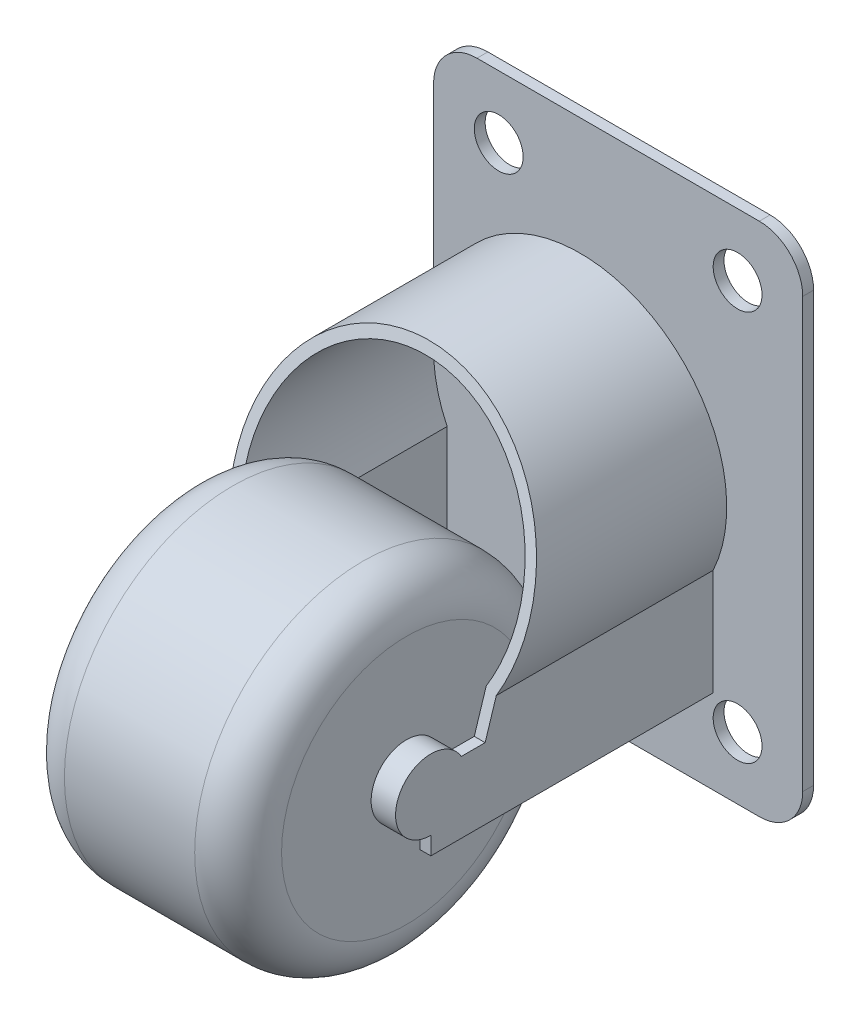
ISO-10303-21;
HEADER;
FILE_DESCRIPTION(('STEP AP214'),'2;1');
FILE_NAME('part.step','',(''),(''),'','','');
FILE_SCHEMA(('AUTOMOTIVE_DESIGN { 1 0 10303 214 1 1 1 1 }'));
ENDSEC;
DATA;
#1=APPLICATION_CONTEXT('core data for automotive mechanical design processes');
#2=APPLICATION_PROTOCOL_DEFINITION('international standard','automotive_design',2000,#1);
#3=PRODUCT_CONTEXT('',#1,'mechanical');
#4=PRODUCT('Part','Part','',(#3));
#5=PRODUCT_RELATED_PRODUCT_CATEGORY('part','',(#4));
#6=PRODUCT_DEFINITION_FORMATION('','',#4);
#7=PRODUCT_DEFINITION_CONTEXT('part definition',#1,'design');
#8=PRODUCT_DEFINITION('design','',#6,#7);
#9=PRODUCT_DEFINITION_SHAPE('','',#8);
#10=(LENGTH_UNIT() NAMED_UNIT(*) SI_UNIT(.MILLI.,.METRE.));
#11=(NAMED_UNIT(*) PLANE_ANGLE_UNIT() SI_UNIT($,.RADIAN.));
#12=(NAMED_UNIT(*) SI_UNIT($,.STERADIAN.) SOLID_ANGLE_UNIT());
#13=UNCERTAINTY_MEASURE_WITH_UNIT(LENGTH_MEASURE(1.E-05),#10,'distance_accuracy_value','');
#14=(GEOMETRIC_REPRESENTATION_CONTEXT(3) GLOBAL_UNCERTAINTY_ASSIGNED_CONTEXT((#13)) GLOBAL_UNIT_ASSIGNED_CONTEXT((#10,
#11,#12)) REPRESENTATION_CONTEXT('',''));
#15=CARTESIAN_POINT('',(0.,0.,0.));
#16=DIRECTION('',(0.,0.,1.));
#17=DIRECTION('',(1.,0.,0.));
#18=AXIS2_PLACEMENT_3D('',#15,#16,#17);
#19=CARTESIAN_POINT('',(-2.,0.,50.));
#20=DIRECTION('',(1.,0.,0.));
#21=DIRECTION('',(0.,0.,-1.));
#22=AXIS2_PLACEMENT_3D('',#19,#20,#21);
#23=PLANE('',#22);
#24=DIRECTION('',(0.,1.,0.));
#25=VECTOR('',#24,1.);
#26=CARTESIAN_POINT('',(-2.,0.,50.));
#27=LINE('',#26,#25);
#28=CARTESIAN_POINT('',(-2.,3.27522082047074,50.));
#29=VERTEX_POINT('',#28);
#30=CARTESIAN_POINT('',(-2.,0.,50.));
#31=VERTEX_POINT('',#30);
#32=EDGE_CURVE('E312',#29,#31,#27,.F.);
#33=ORIENTED_EDGE('',*,*,#32,.F.);
#34=CARTESIAN_POINT('',(-2.,9.77522082047074,50.));
#35=DIRECTION('',(1.,0.,0.));
#36=DIRECTION('',(0.,0.,-1.));
#37=AXIS2_PLACEMENT_3D('',#34,#35,#36);
#38=CIRCLE('',#37,6.5);
#39=CARTESIAN_POINT('',(-2.,13.0632888473468,44.392985763293));
#40=VERTEX_POINT('',#39);
#41=EDGE_CURVE('E256',#29,#40,#38,.F.);
#42=ORIENTED_EDGE('',*,*,#41,.T.);
#43=DIRECTION('',(0.,0.,-1.));
#44=VECTOR('',#43,1.);
#45=CARTESIAN_POINT('',(-2.,13.0632888473468,50.));
#46=LINE('',#45,#44);
#47=CARTESIAN_POINT('',(-2.,13.0632888473468,40.));
#48=VERTEX_POINT('',#47);
#49=EDGE_CURVE('E308',#40,#48,#46,.T.);
#50=ORIENTED_EDGE('',*,*,#49,.T.);
#51=DIRECTION('',(0.,0.95333132220003,-0.301926133536569));
#52=VECTOR('',#51,1.);
#53=CARTESIAN_POINT('',(-2.,-1.68751495672611,44.6716740081952));
#54=LINE('',#53,#52);
#55=CARTESIAN_POINT('',(-2.,19.5504416409415,37.9454771756466));
#56=VERTEX_POINT('',#55);
#57=EDGE_CURVE('E290',#48,#56,#54,.T.);
#58=ORIENTED_EDGE('',*,*,#57,.T.);
#59=DIRECTION('',(0.,0.,-1.));
#60=VECTOR('',#59,1.);
#61=CARTESIAN_POINT('',(-2.,19.5504416409415,50.));
#62=LINE('',#61,#60);
#63=CARTESIAN_POINT('',(-2.,19.5504416409415,-2.));
#64=VERTEX_POINT('',#63);
#65=EDGE_CURVE('E210',#56,#64,#62,.T.);
#66=ORIENTED_EDGE('',*,*,#65,.T.);
#67=DIRECTION('',(0.,1.,0.));
#68=VECTOR('',#67,1.);
#69=CARTESIAN_POINT('',(-2.,0.,-2.));
#70=LINE('',#69,#68);
#71=CARTESIAN_POINT('',(-2.,0.,-2.));
#72=VERTEX_POINT('',#71);
#73=EDGE_CURVE('E207',#72,#64,#70,.T.);
#74=ORIENTED_EDGE('',*,*,#73,.F.);
#75=DIRECTION('',(0.,0.,-1.));
#76=VECTOR('',#75,1.);
#77=CARTESIAN_POINT('',(-2.,0.,50.));
#78=LINE('',#77,#76);
#79=EDGE_CURVE('E192',#31,#72,#78,.T.);
#80=ORIENTED_EDGE('',*,*,#79,.F.);
#81=EDGE_LOOP('',(#33,#42,#50,#58,#66,#74,#80));
#82=FACE_BOUND('',#81,.T.);
#83=ADVANCED_FACE('F38',(#82),#23,.F.);
#84=CARTESIAN_POINT('',(-20.3847763108502,9.77522082047074,50.));
#85=DIRECTION('',(1.,0.,0.));
#86=DIRECTION('',(0.,0.,-1.));
#87=AXIS2_PLACEMENT_3D('',#84,#85,#86);
#88=CYLINDRICAL_SURFACE('',#87,6.5);
#89=ORIENTED_EDGE('',*,*,#41,.F.);
#90=DIRECTION('',(1.,0.,0.));
#91=VECTOR('',#90,1.);
#92=CARTESIAN_POINT('',(-20.3847763108502,3.27522082047074,50.));
#93=LINE('',#92,#91);
#94=CARTESIAN_POINT('',(0.,3.27522082047074,50.));
#95=VERTEX_POINT('',#94);
#96=EDGE_CURVE('E268',#29,#95,#93,.T.);
#97=ORIENTED_EDGE('',*,*,#96,.T.);
#98=CARTESIAN_POINT('',(0.,9.77522082047074,50.));
#99=DIRECTION('',(1.,0.,0.));
#100=DIRECTION('',(0.,0.,-1.));
#101=AXIS2_PLACEMENT_3D('',#98,#99,#100);
#102=CIRCLE('',#101,6.5);
#103=CARTESIAN_POINT('',(0.,13.0632888473468,44.392985763293));
#104=VERTEX_POINT('',#103);
#105=EDGE_CURVE('E265',#95,#104,#102,.T.);
#106=ORIENTED_EDGE('',*,*,#105,.T.);
#107=DIRECTION('',(1.,0.,0.));
#108=VECTOR('',#107,1.);
#109=CARTESIAN_POINT('',(-20.3847763108502,13.0632888473468,44.392985763293));
#110=LINE('',#109,#108);
#111=EDGE_CURVE('E269',#40,#104,#110,.T.);
#112=ORIENTED_EDGE('',*,*,#111,.F.);
#113=EDGE_LOOP('',(#89,#97,#106,#112));
#114=FACE_BOUND('',#113,.T.);
#115=CARTESIAN_POINT('',(2.5,9.77522082047074,50.));
#116=DIRECTION('',(1.,0.,0.));
#117=DIRECTION('',(0.,0.,-1.));
#118=AXIS2_PLACEMENT_3D('',#115,#116,#117);
#119=CIRCLE('',#118,6.5);
#120=CARTESIAN_POINT('',(2.5,9.77522082047074,43.5));
#121=VERTEX_POINT('',#120);
#122=EDGE_CURVE('E252',#121,#121,#119,.F.);
#123=ORIENTED_EDGE('',*,*,#122,.T.);
#124=EDGE_LOOP('',(#123));
#125=FACE_BOUND('',#124,.T.);
#126=ADVANCED_FACE('F538',(#114,#125),#88,.T.);
#127=CARTESIAN_POINT('',(22.5,30.8972473588517,50.));
#128=DIRECTION('',(0.,0.,1.));
#129=DIRECTION('',(1.,0.,0.));
#130=AXIS2_PLACEMENT_3D('',#127,#128,#129);
#131=PLANE('',#130);
#132=ORIENTED_EDGE('',*,*,#96,.F.);
#133=ORIENTED_EDGE('',*,*,#32,.T.);
#134=DIRECTION('',(-1.,0.,0.));
#135=VECTOR('',#134,1.);
#136=CARTESIAN_POINT('',(0.,0.,50.));
#137=LINE('',#136,#135);
#138=CARTESIAN_POINT('',(0.,0.,50.));
#139=VERTEX_POINT('',#138);
#140=EDGE_CURVE('E199',#139,#31,#137,.T.);
#141=ORIENTED_EDGE('',*,*,#140,.F.);
#142=DIRECTION('',(0.,-1.,0.));
#143=VECTOR('',#142,1.);
#144=CARTESIAN_POINT('',(0.,0.,50.));
#145=LINE('',#144,#143);
#146=EDGE_CURVE('E318',#95,#139,#145,.T.);
#147=ORIENTED_EDGE('',*,*,#146,.F.);
#148=EDGE_LOOP('',(#132,#133,#141,#147));
#149=FACE_BOUND('',#148,.T.);
#150=ADVANCED_FACE('F543',(#149),#131,.T.);
#151=DIRECTION('',(1.,0.,0.));
#152=VECTOR('',#151,1.);
#153=CARTESIAN_POINT('',(-20.3847763108502,3.27522082047074,50.));
#154=LINE('',#153,#152);
#155=CARTESIAN_POINT('',(45.,3.27522082047074,50.));
#156=VERTEX_POINT('',#155);
#157=CARTESIAN_POINT('',(47.,3.27522082047074,50.));
#158=VERTEX_POINT('',#157);
#159=EDGE_CURVE('E264',#156,#158,#154,.T.);
#160=ORIENTED_EDGE('',*,*,#159,.F.);
#161=DIRECTION('',(0.,1.,0.));
#162=VECTOR('',#161,1.);
#163=CARTESIAN_POINT('',(45.,0.,50.));
#164=LINE('',#163,#162);
#165=CARTESIAN_POINT('',(45.,0.,50.));
#166=VERTEX_POINT('',#165);
#167=EDGE_CURVE('E321',#166,#156,#164,.T.);
#168=ORIENTED_EDGE('',*,*,#167,.F.);
#169=DIRECTION('',(-1.,0.,0.));
#170=VECTOR('',#169,1.);
#171=CARTESIAN_POINT('',(47.,0.,50.));
#172=LINE('',#171,#170);
#173=CARTESIAN_POINT('',(47.,0.,50.));
#174=VERTEX_POINT('',#173);
#175=EDGE_CURVE('E325',#174,#166,#172,.T.);
#176=ORIENTED_EDGE('',*,*,#175,.F.);
#177=DIRECTION('',(0.,1.,0.));
#178=VECTOR('',#177,1.);
#179=CARTESIAN_POINT('',(47.,0.,50.));
#180=LINE('',#179,#178);
#181=EDGE_CURVE('E329',#174,#158,#180,.T.);
#182=ORIENTED_EDGE('',*,*,#181,.T.);
#183=EDGE_LOOP('',(#160,#168,#176,#182));
#184=FACE_BOUND('',#183,.T.);
#185=ADVANCED_FACE('F828',(#184),#131,.T.);
#186=CARTESIAN_POINT('',(22.5,30.8972473588517,50.));
#187=DIRECTION('',(0.,0.,-1.));
#188=DIRECTION('',(-1.,0.,0.));
#189=AXIS2_PLACEMENT_3D('',#186,#187,#188);
#190=CYLINDRICAL_SURFACE('',#189,25.);
#191=CARTESIAN_POINT('',(22.5,30.8972473588517,34.3518711557654));
#192=DIRECTION('',(0.,-0.301926133536569,-0.95333132220003));
#193=DIRECTION('',(0.,0.95333132220003,-0.301926133536569));
#194=AXIS2_PLACEMENT_3D('',#191,#192,#193);
#195=ELLIPSE('',#194,26.2238315450569,25.);
#196=CARTESIAN_POINT('',(0.,20.,37.8030991649919));
#197=VERTEX_POINT('',#196);
#198=CARTESIAN_POINT('',(45.,20.,37.8030991649919));
#199=VERTEX_POINT('',#198);
#200=EDGE_CURVE('E296',#197,#199,#195,.T.);
#201=ORIENTED_EDGE('',*,*,#200,.F.);
#202=DIRECTION('',(0.,0.,-1.));
#203=VECTOR('',#202,1.);
#204=CARTESIAN_POINT('',(0.,20.,50.));
#205=LINE('',#204,#203);
#206=CARTESIAN_POINT('',(0.,20.,0.));
#207=VERTEX_POINT('',#206);
#208=EDGE_CURVE('E357',#197,#207,#205,.T.);
#209=ORIENTED_EDGE('',*,*,#208,.T.);
#210=CARTESIAN_POINT('',(22.5,30.8972473588517,0.));
#211=DIRECTION('',(0.,0.,1.));
#212=DIRECTION('',(-1.,0.,0.));
#213=AXIS2_PLACEMENT_3D('',#210,#211,#212);
#214=CIRCLE('',#213,25.);
#215=CARTESIAN_POINT('',(45.,20.,0.));
#216=VERTEX_POINT('',#215);
#217=EDGE_CURVE('E336',#216,#207,#214,.T.);
#218=ORIENTED_EDGE('',*,*,#217,.F.);
#219=DIRECTION('',(0.,0.,-1.));
#220=VECTOR('',#219,1.);
#221=CARTESIAN_POINT('',(45.,20.,50.));
#222=LINE('',#221,#220);
#223=EDGE_CURVE('E354',#199,#216,#222,.T.);
#224=ORIENTED_EDGE('',*,*,#223,.F.);
#225=EDGE_LOOP('',(#201,#209,#218,#224));
#226=FACE_BOUND('',#225,.T.);
#227=ADVANCED_FACE('F819',(#226),#190,.F.);
#228=CARTESIAN_POINT('',(22.5,30.8972473588517,50.));
#229=DIRECTION('',(0.,0.,-1.));
#230=DIRECTION('',(-1.,0.,0.));
#231=AXIS2_PLACEMENT_3D('',#228,#229,#230);
#232=CYLINDRICAL_SURFACE('',#231,27.);
#233=CARTESIAN_POINT('',(22.5,30.8972473588517,34.3518711557654));
#234=DIRECTION('',(0.,-0.301926133536569,-0.95333132220003));
#235=DIRECTION('',(0.,0.95333132220003,-0.301926133536569));
#236=AXIS2_PLACEMENT_3D('',#233,#234,#235);
#237=ELLIPSE('',#236,28.3217380686615,27.);
#238=CARTESIAN_POINT('',(47.,19.5504416409415,37.9454771756466));
#239=VERTEX_POINT('',#238);
#240=EDGE_CURVE('E203',#56,#239,#237,.T.);
#241=ORIENTED_EDGE('',*,*,#240,.T.);
#242=DIRECTION('',(0.,0.,-1.));
#243=VECTOR('',#242,1.);
#244=CARTESIAN_POINT('',(47.,19.5504416409415,50.));
#245=LINE('',#244,#243);
#246=CARTESIAN_POINT('',(47.,19.5504416409415,-2.));
#247=VERTEX_POINT('',#246);
#248=EDGE_CURVE('E345',#239,#247,#245,.T.);
#249=ORIENTED_EDGE('',*,*,#248,.T.);
#250=CARTESIAN_POINT('',(22.5,30.8972473588517,-2.));
#251=DIRECTION('',(0.,0.,-1.));
#252=DIRECTION('',(-1.,0.,0.));
#253=AXIS2_PLACEMENT_3D('',#250,#251,#252);
#254=CIRCLE('',#253,27.);
#255=EDGE_CURVE('E215',#64,#247,#254,.T.);
#256=ORIENTED_EDGE('',*,*,#255,.F.);
#257=ORIENTED_EDGE('',*,*,#65,.F.);
#258=EDGE_LOOP('',(#241,#249,#256,#257));
#259=FACE_BOUND('',#258,.T.);
#260=ADVANCED_FACE('F667',(#259),#232,.T.);
#261=CARTESIAN_POINT('',(0.,0.,50.));
#262=DIRECTION('',(1.,0.,0.));
#263=DIRECTION('',(0.,0.,-1.));
#264=AXIS2_PLACEMENT_3D('',#261,#262,#263);
#265=PLANE('',#264);
#266=ORIENTED_EDGE('',*,*,#105,.F.);
#267=ORIENTED_EDGE('',*,*,#146,.T.);
#268=DIRECTION('',(0.,0.,-1.));
#269=VECTOR('',#268,1.);
#270=CARTESIAN_POINT('',(0.,0.,50.));
#271=LINE('',#270,#269);
#272=CARTESIAN_POINT('',(0.,0.,0.));
#273=VERTEX_POINT('',#272);
#274=EDGE_CURVE('E204',#139,#273,#271,.T.);
#275=ORIENTED_EDGE('',*,*,#274,.T.);
#276=DIRECTION('',(0.,-1.,0.));
#277=VECTOR('',#276,1.);
#278=CARTESIAN_POINT('',(0.,0.,0.));
#279=LINE('',#278,#277);
#280=EDGE_CURVE('E311',#207,#273,#279,.T.);
#281=ORIENTED_EDGE('',*,*,#280,.F.);
#282=ORIENTED_EDGE('',*,*,#208,.F.);
#283=DIRECTION('',(0.,0.95333132220003,-0.301926133536569));
#284=VECTOR('',#283,1.);
#285=CARTESIAN_POINT('',(0.,-1.68751495672611,44.6716740081952));
#286=LINE('',#285,#284);
#287=CARTESIAN_POINT('',(0.,13.0632888473468,40.));
#288=VERTEX_POINT('',#287);
#289=EDGE_CURVE('E299',#288,#197,#286,.T.);
#290=ORIENTED_EDGE('',*,*,#289,.F.);
#291=DIRECTION('',(0.,0.,-1.));
#292=VECTOR('',#291,1.);
#293=CARTESIAN_POINT('',(0.,13.0632888473468,50.));
#294=LINE('',#293,#292);
#295=EDGE_CURVE('E305',#104,#288,#294,.T.);
#296=ORIENTED_EDGE('',*,*,#295,.F.);
#297=EDGE_LOOP('',(#266,#267,#275,#281,#282,#290,#296));
#298=FACE_BOUND('',#297,.T.);
#299=ADVANCED_FACE('F549',(#298),#265,.T.);
#300=CARTESIAN_POINT('',(45.,0.,50.));
#301=DIRECTION('',(-1.,0.,0.));
#302=DIRECTION('',(0.,0.,1.));
#303=AXIS2_PLACEMENT_3D('',#300,#301,#302);
#304=PLANE('',#303);
#305=CARTESIAN_POINT('',(45.,9.77522082047074,50.));
#306=DIRECTION('',(-1.,0.,0.));
#307=DIRECTION('',(0.,0.,1.));
#308=AXIS2_PLACEMENT_3D('',#305,#306,#307);
#309=CIRCLE('',#308,6.5);
#310=CARTESIAN_POINT('',(45.,13.0632888473468,44.392985763293));
#311=VERTEX_POINT('',#310);
#312=EDGE_CURVE('E261',#311,#156,#309,.T.);
#313=ORIENTED_EDGE('',*,*,#312,.F.);
#314=DIRECTION('',(0.,0.,1.));
#315=VECTOR('',#314,1.);
#316=CARTESIAN_POINT('',(45.,13.0632888473468,50.));
#317=LINE('',#316,#315);
#318=CARTESIAN_POINT('',(45.,13.0632888473468,40.));
#319=VERTEX_POINT('',#318);
#320=EDGE_CURVE('E302',#319,#311,#317,.T.);
#321=ORIENTED_EDGE('',*,*,#320,.F.);
#322=DIRECTION('',(0.,-0.95333132220003,0.301926133536569));
#323=VECTOR('',#322,1.);
#324=CARTESIAN_POINT('',(45.,-1.6875149567261,44.6716740081952));
#325=LINE('',#324,#323);
#326=EDGE_CURVE('E293',#199,#319,#325,.T.);
#327=ORIENTED_EDGE('',*,*,#326,.F.);
#328=ORIENTED_EDGE('',*,*,#223,.T.);
#329=DIRECTION('',(0.,1.,0.));
#330=VECTOR('',#329,1.);
#331=CARTESIAN_POINT('',(45.,0.,0.));
#332=LINE('',#331,#330);
#333=CARTESIAN_POINT('',(45.,0.,0.));
#334=VERTEX_POINT('',#333);
#335=EDGE_CURVE('E315',#334,#216,#332,.T.);
#336=ORIENTED_EDGE('',*,*,#335,.F.);
#337=DIRECTION('',(0.,0.,-1.));
#338=VECTOR('',#337,1.);
#339=CARTESIAN_POINT('',(45.,0.,50.));
#340=LINE('',#339,#338);
#341=EDGE_CURVE('E351',#166,#334,#340,.T.);
#342=ORIENTED_EDGE('',*,*,#341,.F.);
#343=ORIENTED_EDGE('',*,*,#167,.T.);
#344=EDGE_LOOP('',(#313,#321,#327,#328,#336,#342,#343));
#345=FACE_BOUND('',#344,.T.);
#346=ADVANCED_FACE('F666',(#345),#304,.T.);
#347=CARTESIAN_POINT('',(47.,0.,50.));
#348=DIRECTION('',(0.,-1.,0.));
#349=DIRECTION('',(0.,0.,-1.));
#350=AXIS2_PLACEMENT_3D('',#347,#348,#349);
#351=PLANE('',#350);
#352=ORIENTED_EDGE('',*,*,#341,.T.);
#353=DIRECTION('',(-1.,0.,0.));
#354=VECTOR('',#353,1.);
#355=CARTESIAN_POINT('',(47.,0.,0.));
#356=LINE('',#355,#354);
#357=EDGE_CURVE('E222',#334,#273,#356,.T.);
#358=ORIENTED_EDGE('',*,*,#357,.T.);
#359=ORIENTED_EDGE('',*,*,#274,.F.);
#360=ORIENTED_EDGE('',*,*,#140,.T.);
#361=ORIENTED_EDGE('',*,*,#79,.T.);
#362=DIRECTION('',(-1.,0.,0.));
#363=VECTOR('',#362,1.);
#364=CARTESIAN_POINT('',(47.,0.,-2.));
#365=LINE('',#364,#363);
#366=CARTESIAN_POINT('',(47.,0.,-2.));
#367=VERTEX_POINT('',#366);
#368=EDGE_CURVE('E196',#367,#72,#365,.T.);
#369=ORIENTED_EDGE('',*,*,#368,.F.);
#370=DIRECTION('',(0.,0.,-1.));
#371=VECTOR('',#370,1.);
#372=CARTESIAN_POINT('',(47.,0.,50.));
#373=LINE('',#372,#371);
#374=EDGE_CURVE('E348',#174,#367,#373,.T.);
#375=ORIENTED_EDGE('',*,*,#374,.F.);
#376=ORIENTED_EDGE('',*,*,#175,.T.);
#377=EDGE_LOOP('',(#352,#358,#359,#360,#361,#369,#375,#376));
#378=FACE_BOUND('',#377,.T.);
#379=ADVANCED_FACE('F194',(#378),#351,.T.);
#380=CARTESIAN_POINT('',(47.,0.,50.));
#381=DIRECTION('',(-1.,0.,0.));
#382=DIRECTION('',(0.,0.,1.));
#383=AXIS2_PLACEMENT_3D('',#380,#381,#382);
#384=PLANE('',#383);
#385=CARTESIAN_POINT('',(47.,9.77522082047074,50.));
#386=DIRECTION('',(1.,0.,0.));
#387=DIRECTION('',(0.,0.,-1.));
#388=AXIS2_PLACEMENT_3D('',#385,#386,#387);
#389=CIRCLE('',#388,6.5);
#390=CARTESIAN_POINT('',(47.,13.0632888473468,44.392985763293));
#391=VERTEX_POINT('',#390);
#392=EDGE_CURVE('E253',#391,#158,#389,.T.);
#393=ORIENTED_EDGE('',*,*,#392,.T.);
#394=ORIENTED_EDGE('',*,*,#181,.F.);
#395=ORIENTED_EDGE('',*,*,#374,.T.);
#396=DIRECTION('',(0.,-1.,0.));
#397=VECTOR('',#396,1.);
#398=CARTESIAN_POINT('',(47.,19.5504416409415,-2.));
#399=LINE('',#398,#397);
#400=EDGE_CURVE('E220',#247,#367,#399,.T.);
#401=ORIENTED_EDGE('',*,*,#400,.F.);
#402=ORIENTED_EDGE('',*,*,#248,.F.);
#403=DIRECTION('',(0.,-0.95333132220003,0.301926133536569));
#404=VECTOR('',#403,1.);
#405=CARTESIAN_POINT('',(47.,-1.6875149567261,44.6716740081952));
#406=LINE('',#405,#404);
#407=CARTESIAN_POINT('',(47.,13.0632888473468,40.));
#408=VERTEX_POINT('',#407);
#409=EDGE_CURVE('E286',#239,#408,#406,.T.);
#410=ORIENTED_EDGE('',*,*,#409,.T.);
#411=DIRECTION('',(0.,0.,1.));
#412=VECTOR('',#411,1.);
#413=CARTESIAN_POINT('',(47.,13.0632888473468,50.));
#414=LINE('',#413,#412);
#415=EDGE_CURVE('E364',#408,#391,#414,.T.);
#416=ORIENTED_EDGE('',*,*,#415,.T.);
#417=EDGE_LOOP('',(#393,#394,#395,#401,#402,#410,#416));
#418=FACE_BOUND('',#417,.T.);
#419=ADVANCED_FACE('F681',(#418),#384,.F.);
#420=CARTESIAN_POINT('',(-4.5,13.0632888473468,46.8498222071155));
#421=DIRECTION('',(0.,-1.,0.));
#422=DIRECTION('',(0.,0.,-1.));
#423=AXIS2_PLACEMENT_3D('',#420,#421,#422);
#424=PLANE('',#423);
#425=ORIENTED_EDGE('',*,*,#295,.T.);
#426=DIRECTION('',(1.,0.,0.));
#427=VECTOR('',#426,1.);
#428=CARTESIAN_POINT('',(-4.5,13.0632888473468,40.));
#429=LINE('',#428,#427);
#430=EDGE_CURVE('E285',#48,#288,#429,.T.);
#431=ORIENTED_EDGE('',*,*,#430,.F.);
#432=ORIENTED_EDGE('',*,*,#49,.F.);
#433=ORIENTED_EDGE('',*,*,#111,.T.);
#434=EDGE_LOOP('',(#425,#431,#432,#433));
#435=FACE_BOUND('',#434,.T.);
#436=ADVANCED_FACE('F675',(#435),#424,.F.);
#437=ORIENTED_EDGE('',*,*,#320,.T.);
#438=DIRECTION('',(1.,0.,0.));
#439=VECTOR('',#438,1.);
#440=CARTESIAN_POINT('',(-20.3847763108502,13.0632888473468,44.392985763293));
#441=LINE('',#440,#439);
#442=EDGE_CURVE('E260',#311,#391,#441,.T.);
#443=ORIENTED_EDGE('',*,*,#442,.T.);
#444=ORIENTED_EDGE('',*,*,#415,.F.);
#445=EDGE_CURVE('E281',#319,#408,#429,.T.);
#446=ORIENTED_EDGE('',*,*,#445,.F.);
#447=EDGE_LOOP('',(#437,#443,#444,#446));
#448=FACE_BOUND('',#447,.T.);
#449=ADVANCED_FACE('F680',(#448),#424,.F.);
#450=CARTESIAN_POINT('',(-4.5,83.809513236909,17.5942177762946));
#451=DIRECTION('',(0.,-0.301926133536569,-0.95333132220003));
#452=DIRECTION('',(0.,0.95333132220003,-0.301926133536569));
#453=AXIS2_PLACEMENT_3D('',#450,#451,#452);
#454=PLANE('',#453);
#455=ORIENTED_EDGE('',*,*,#289,.T.);
#456=ORIENTED_EDGE('',*,*,#200,.T.);
#457=ORIENTED_EDGE('',*,*,#326,.T.);
#458=ORIENTED_EDGE('',*,*,#445,.T.);
#459=ORIENTED_EDGE('',*,*,#409,.F.);
#460=ORIENTED_EDGE('',*,*,#240,.F.);
#461=ORIENTED_EDGE('',*,*,#57,.F.);
#462=ORIENTED_EDGE('',*,*,#430,.T.);
#463=EDGE_LOOP('',(#455,#456,#457,#458,#459,#460,#461,#462));
#464=FACE_BOUND('',#463,.T.);
#465=ADVANCED_FACE('F775',(#464),#454,.F.);
#466=ORIENTED_EDGE('',*,*,#442,.F.);
#467=ORIENTED_EDGE('',*,*,#312,.T.);
#468=ORIENTED_EDGE('',*,*,#159,.T.);
#469=ORIENTED_EDGE('',*,*,#392,.F.);
#470=EDGE_LOOP('',(#466,#467,#468,#469));
#471=FACE_BOUND('',#470,.T.);
#472=CARTESIAN_POINT('',(42.5,9.77522082047074,50.));
#473=DIRECTION('',(1.,0.,0.));
#474=DIRECTION('',(0.,0.,-1.));
#475=AXIS2_PLACEMENT_3D('',#472,#473,#474);
#476=CIRCLE('',#475,6.5);
#477=CARTESIAN_POINT('',(42.5,9.77522082047074,43.5));
#478=VERTEX_POINT('',#477);
#479=EDGE_CURVE('E367',#478,#478,#476,.F.);
#480=ORIENTED_EDGE('',*,*,#479,.F.);
#481=EDGE_LOOP('',(#480));
#482=FACE_BOUND('',#481,.T.);
#483=ADVANCED_FACE('F546',(#471,#482),#88,.T.);
#484=CARTESIAN_POINT('',(2.5,9.77522082047074,50.));
#485=DIRECTION('',(1.,0.,0.));
#486=DIRECTION('',(0.,0.,-1.));
#487=AXIS2_PLACEMENT_3D('',#484,#485,#486);
#488=CYLINDRICAL_SURFACE('',#487,31.);
#489=CARTESIAN_POINT('',(10.5,9.77522082047074,50.));
#490=DIRECTION('',(1.,0.,0.));
#491=DIRECTION('',(0.,0.,-1.));
#492=AXIS2_PLACEMENT_3D('',#489,#490,#491);
#493=CIRCLE('',#492,31.);
#494=CARTESIAN_POINT('',(10.5,9.77522082047074,19.));
#495=VERTEX_POINT('',#494);
#496=EDGE_CURVE('E240',#495,#495,#493,.T.);
#497=ORIENTED_EDGE('',*,*,#496,.T.);
#498=EDGE_LOOP('',(#497));
#499=FACE_BOUND('',#498,.T.);
#500=CARTESIAN_POINT('',(34.5,9.77522082047074,50.));
#501=DIRECTION('',(1.,0.,0.));
#502=DIRECTION('',(0.,0.,-1.));
#503=AXIS2_PLACEMENT_3D('',#500,#501,#502);
#504=CIRCLE('',#503,31.);
#505=CARTESIAN_POINT('',(34.5,9.77522082047074,19.));
#506=VERTEX_POINT('',#505);
#507=EDGE_CURVE('E235',#506,#506,#504,.F.);
#508=ORIENTED_EDGE('',*,*,#507,.T.);
#509=EDGE_LOOP('',(#508));
#510=FACE_BOUND('',#509,.T.);
#511=ADVANCED_FACE('F760',(#499,#510),#488,.T.);
#512=CARTESIAN_POINT('',(2.5,9.77522082047074,50.));
#513=DIRECTION('',(1.,0.,0.));
#514=DIRECTION('',(0.,0.,-1.));
#515=AXIS2_PLACEMENT_3D('',#512,#513,#514);
#516=PLANE('',#515);
#517=ORIENTED_EDGE('',*,*,#122,.F.);
#518=EDGE_LOOP('',(#517));
#519=FACE_BOUND('',#518,.T.);
#520=CARTESIAN_POINT('',(2.5,9.77522082047074,50.));
#521=DIRECTION('',(1.,0.,0.));
#522=DIRECTION('',(0.,0.,-1.));
#523=AXIS2_PLACEMENT_3D('',#520,#521,#522);
#524=CIRCLE('',#523,23.);
#525=CARTESIAN_POINT('',(2.5,9.77522082047074,27.));
#526=VERTEX_POINT('',#525);
#527=EDGE_CURVE('E244',#526,#526,#524,.F.);
#528=ORIENTED_EDGE('',*,*,#527,.T.);
#529=EDGE_LOOP('',(#528));
#530=FACE_BOUND('',#529,.T.);
#531=ADVANCED_FACE('F752',(#519,#530),#516,.F.);
#532=CARTESIAN_POINT('',(42.5,9.77522082047074,50.));
#533=DIRECTION('',(1.,0.,0.));
#534=DIRECTION('',(0.,0.,-1.));
#535=AXIS2_PLACEMENT_3D('',#532,#533,#534);
#536=PLANE('',#535);
#537=ORIENTED_EDGE('',*,*,#479,.T.);
#538=EDGE_LOOP('',(#537));
#539=FACE_BOUND('',#538,.T.);
#540=CARTESIAN_POINT('',(42.5,9.77522082047074,50.));
#541=DIRECTION('',(1.,0.,0.));
#542=DIRECTION('',(0.,0.,-1.));
#543=AXIS2_PLACEMENT_3D('',#540,#541,#542);
#544=CIRCLE('',#543,23.);
#545=CARTESIAN_POINT('',(42.5,9.77522082047074,27.));
#546=VERTEX_POINT('',#545);
#547=EDGE_CURVE('E248',#546,#546,#544,.T.);
#548=ORIENTED_EDGE('',*,*,#547,.T.);
#549=EDGE_LOOP('',(#548));
#550=FACE_BOUND('',#549,.T.);
#551=ADVANCED_FACE('F744',(#539,#550),#536,.T.);
#552=CARTESIAN_POINT('',(10.5,9.77522082047074,50.));
#553=DIRECTION('',(1.,0.,0.));
#554=DIRECTION('',(0.,0.,-1.));
#555=AXIS2_PLACEMENT_3D('',#552,#553,#554);
#556=TOROIDAL_SURFACE('',#555,23.,8.);
#557=ORIENTED_EDGE('',*,*,#527,.F.);
#558=EDGE_LOOP('',(#557));
#559=FACE_BOUND('',#558,.T.);
#560=ORIENTED_EDGE('',*,*,#496,.F.);
#561=EDGE_LOOP('',(#560));
#562=FACE_BOUND('',#561,.T.);
#563=ADVANCED_FACE('F735',(#559,#562),#556,.T.);
#564=CARTESIAN_POINT('',(34.5,9.77522082047074,50.));
#565=DIRECTION('',(1.,0.,0.));
#566=DIRECTION('',(0.,0.,-1.));
#567=AXIS2_PLACEMENT_3D('',#564,#565,#566);
#568=TOROIDAL_SURFACE('',#567,23.,8.);
#569=ORIENTED_EDGE('',*,*,#507,.F.);
#570=EDGE_LOOP('',(#569));
#571=FACE_BOUND('',#570,.T.);
#572=ORIENTED_EDGE('',*,*,#547,.F.);
#573=EDGE_LOOP('',(#572));
#574=FACE_BOUND('',#573,.T.);
#575=ADVANCED_FACE('F726',(#571,#574),#568,.T.);
#576=CARTESIAN_POINT('',(22.5,30.8972473588517,0.));
#577=DIRECTION('',(0.,0.,-1.));
#578=DIRECTION('',(-1.,0.,0.));
#579=AXIS2_PLACEMENT_3D('',#576,#577,#578);
#580=PLANE('',#579);
#581=ORIENTED_EDGE('',*,*,#357,.F.);
#582=ORIENTED_EDGE('',*,*,#335,.T.);
#583=ORIENTED_EDGE('',*,*,#217,.T.);
#584=ORIENTED_EDGE('',*,*,#280,.T.);
#585=EDGE_LOOP('',(#581,#582,#583,#584));
#586=FACE_BOUND('',#585,.T.);
#587=ADVANCED_FACE('F718',(#586),#580,.F.);
#588=CARTESIAN_POINT('',(22.5,30.8972473588517,-2.));
#589=DIRECTION('',(0.,0.,-1.));
#590=DIRECTION('',(-1.,0.,0.));
#591=AXIS2_PLACEMENT_3D('',#588,#589,#590);
#592=PLANE('',#591);
#593=CARTESIAN_POINT('',(22.5,25.,-2.));
#594=DIRECTION('',(0.,0.,-1.));
#595=DIRECTION('',(-1.,0.,0.));
#596=AXIS2_PLACEMENT_3D('',#593,#594,#595);
#597=CIRCLE('',#596,10.);
#598=CARTESIAN_POINT('',(12.5,25.,-2.));
#599=VERTEX_POINT('',#598);
#600=EDGE_CURVE('E229',#599,#599,#597,.T.);
#601=ORIENTED_EDGE('',*,*,#600,.F.);
#602=EDGE_LOOP('',(#601));
#603=FACE_BOUND('',#602,.T.);
#604=ORIENTED_EDGE('',*,*,#368,.T.);
#605=ORIENTED_EDGE('',*,*,#73,.T.);
#606=ORIENTED_EDGE('',*,*,#255,.T.);
#607=ORIENTED_EDGE('',*,*,#400,.T.);
#608=EDGE_LOOP('',(#604,#605,#606,#607));
#609=FACE_BOUND('',#608,.T.);
#610=ADVANCED_FACE('F218',(#603,#609),#592,.T.);
#611=CARTESIAN_POINT('',(22.5,25.,-9.));
#612=DIRECTION('',(0.,0.,1.));
#613=DIRECTION('',(1.,0.,0.));
#614=AXIS2_PLACEMENT_3D('',#611,#612,#613);
#615=CYLINDRICAL_SURFACE('',#614,10.);
#616=CARTESIAN_POINT('',(22.5,25.,-9.));
#617=DIRECTION('',(0.,0.,-1.));
#618=DIRECTION('',(-1.,0.,0.));
#619=AXIS2_PLACEMENT_3D('',#616,#617,#618);
#620=CIRCLE('',#619,10.);
#621=CARTESIAN_POINT('',(12.5,25.,-9.));
#622=VERTEX_POINT('',#621);
#623=EDGE_CURVE('E226',#622,#622,#620,.T.);
#624=ORIENTED_EDGE('',*,*,#623,.F.);
#625=EDGE_LOOP('',(#624));
#626=FACE_BOUND('',#625,.T.);
#627=ORIENTED_EDGE('',*,*,#600,.T.);
#628=EDGE_LOOP('',(#627));
#629=FACE_BOUND('',#628,.T.);
#630=ADVANCED_FACE('F535',(#626,#629),#615,.T.);
#631=CARTESIAN_POINT('',(-11.5,-22.5,-11.));
#632=DIRECTION('',(1.,0.,0.));
#633=DIRECTION('',(0.,0.,-1.));
#634=AXIS2_PLACEMENT_3D('',#631,#632,#633);
#635=PLANE('',#634);
#636=DIRECTION('',(0.,1.,0.));
#637=VECTOR('',#636,1.);
#638=CARTESIAN_POINT('',(-11.5,-22.5,-9.));
#639=LINE('',#638,#637);
#640=CARTESIAN_POINT('',(-11.5,-14.5,-9.));
#641=VERTEX_POINT('',#640);
#642=CARTESIAN_POINT('',(-11.5,64.5,-9.));
#643=VERTEX_POINT('',#642);
#644=EDGE_CURVE('E435',#641,#643,#639,.T.);
#645=ORIENTED_EDGE('',*,*,#644,.T.);
#646=DIRECTION('',(0.,0.,1.));
#647=VECTOR('',#646,1.);
#648=CARTESIAN_POINT('',(-11.5,64.5,-11.));
#649=LINE('',#648,#647);
#650=CARTESIAN_POINT('',(-11.5,64.5,-11.));
#651=VERTEX_POINT('',#650);
#652=EDGE_CURVE('E415',#643,#651,#649,.F.);
#653=ORIENTED_EDGE('',*,*,#652,.T.);
#654=DIRECTION('',(0.,1.,0.));
#655=VECTOR('',#654,1.);
#656=CARTESIAN_POINT('',(-11.5,-22.5,-11.));
#657=LINE('',#656,#655);
#658=CARTESIAN_POINT('',(-11.5,-14.5,-11.));
#659=VERTEX_POINT('',#658);
#660=EDGE_CURVE('E458',#659,#651,#657,.T.);
#661=ORIENTED_EDGE('',*,*,#660,.F.);
#662=DIRECTION('',(0.,0.,1.));
#663=VECTOR('',#662,1.);
#664=CARTESIAN_POINT('',(-11.5,-14.5,-11.));
#665=LINE('',#664,#663);
#666=EDGE_CURVE('E411',#659,#641,#665,.T.);
#667=ORIENTED_EDGE('',*,*,#666,.T.);
#668=EDGE_LOOP('',(#645,#653,#661,#667));
#669=FACE_BOUND('',#668,.T.);
#670=ADVANCED_FACE('F524',(#669),#635,.F.);
#671=CARTESIAN_POINT('',(56.5,72.5,-11.));
#672=DIRECTION('',(0.,-1.,0.));
#673=DIRECTION('',(0.,0.,-1.));
#674=AXIS2_PLACEMENT_3D('',#671,#672,#673);
#675=PLANE('',#674);
#676=DIRECTION('',(1.,0.,0.));
#677=VECTOR('',#676,1.);
#678=CARTESIAN_POINT('',(56.5,72.5,-9.));
#679=LINE('',#678,#677);
#680=CARTESIAN_POINT('',(-3.5,72.5,-9.));
#681=VERTEX_POINT('',#680);
#682=CARTESIAN_POINT('',(48.5,72.5,-9.));
#683=VERTEX_POINT('',#682);
#684=EDGE_CURVE('E440',#681,#683,#679,.T.);
#685=ORIENTED_EDGE('',*,*,#684,.T.);
#686=DIRECTION('',(0.,0.,1.));
#687=VECTOR('',#686,1.);
#688=CARTESIAN_POINT('',(48.5,72.5,-11.));
#689=LINE('',#688,#687);
#690=CARTESIAN_POINT('',(48.5,72.5,-11.));
#691=VERTEX_POINT('',#690);
#692=EDGE_CURVE('E397',#683,#691,#689,.F.);
#693=ORIENTED_EDGE('',*,*,#692,.T.);
#694=DIRECTION('',(1.,0.,0.));
#695=VECTOR('',#694,1.);
#696=CARTESIAN_POINT('',(56.5,72.5,-11.));
#697=LINE('',#696,#695);
#698=CARTESIAN_POINT('',(-3.5,72.5,-11.));
#699=VERTEX_POINT('',#698);
#700=EDGE_CURVE('E467',#699,#691,#697,.T.);
#701=ORIENTED_EDGE('',*,*,#700,.F.);
#702=DIRECTION('',(0.,0.,1.));
#703=VECTOR('',#702,1.);
#704=CARTESIAN_POINT('',(-3.5,72.5,-11.));
#705=LINE('',#704,#703);
#706=EDGE_CURVE('E393',#699,#681,#705,.T.);
#707=ORIENTED_EDGE('',*,*,#706,.T.);
#708=EDGE_LOOP('',(#685,#693,#701,#707));
#709=FACE_BOUND('',#708,.T.);
#710=ADVANCED_FACE('F527',(#709),#675,.F.);
#711=CARTESIAN_POINT('',(56.5,-22.5,-11.));
#712=DIRECTION('',(-1.,0.,0.));
#713=DIRECTION('',(0.,0.,1.));
#714=AXIS2_PLACEMENT_3D('',#711,#712,#713);
#715=PLANE('',#714);
#716=DIRECTION('',(0.,-1.,0.));
#717=VECTOR('',#716,1.);
#718=CARTESIAN_POINT('',(56.5,-22.5,-11.));
#719=LINE('',#718,#717);
#720=CARTESIAN_POINT('',(56.5,64.5,-11.));
#721=VERTEX_POINT('',#720);
#722=CARTESIAN_POINT('',(56.5,-14.5,-11.));
#723=VERTEX_POINT('',#722);
#724=EDGE_CURVE('E464',#721,#723,#719,.T.);
#725=ORIENTED_EDGE('',*,*,#724,.F.);
#726=DIRECTION('',(0.,0.,1.));
#727=VECTOR('',#726,1.);
#728=CARTESIAN_POINT('',(56.5,64.5,-11.));
#729=LINE('',#728,#727);
#730=CARTESIAN_POINT('',(56.5,64.5,-9.));
#731=VERTEX_POINT('',#730);
#732=EDGE_CURVE('E377',#721,#731,#729,.T.);
#733=ORIENTED_EDGE('',*,*,#732,.T.);
#734=DIRECTION('',(0.,-1.,0.));
#735=VECTOR('',#734,1.);
#736=CARTESIAN_POINT('',(56.5,-22.5,-9.));
#737=LINE('',#736,#735);
#738=CARTESIAN_POINT('',(56.5,-14.5,-9.));
#739=VERTEX_POINT('',#738);
#740=EDGE_CURVE('E447',#731,#739,#737,.T.);
#741=ORIENTED_EDGE('',*,*,#740,.T.);
#742=DIRECTION('',(0.,0.,1.));
#743=VECTOR('',#742,1.);
#744=CARTESIAN_POINT('',(56.5,-14.5,-11.));
#745=LINE('',#744,#743);
#746=EDGE_CURVE('E374',#739,#723,#745,.F.);
#747=ORIENTED_EDGE('',*,*,#746,.T.);
#748=EDGE_LOOP('',(#725,#733,#741,#747));
#749=FACE_BOUND('',#748,.T.);
#750=ADVANCED_FACE('F513',(#749),#715,.F.);
#751=CARTESIAN_POINT('',(56.5,-22.5,-11.));
#752=DIRECTION('',(0.,1.,0.));
#753=DIRECTION('',(0.,0.,1.));
#754=AXIS2_PLACEMENT_3D('',#751,#752,#753);
#755=PLANE('',#754);
#756=DIRECTION('',(-1.,0.,0.));
#757=VECTOR('',#756,1.);
#758=CARTESIAN_POINT('',(56.5,-22.5,-11.));
#759=LINE('',#758,#757);
#760=CARTESIAN_POINT('',(48.5,-22.5,-11.));
#761=VERTEX_POINT('',#760);
#762=CARTESIAN_POINT('',(-3.5,-22.5,-11.));
#763=VERTEX_POINT('',#762);
#764=EDGE_CURVE('E450',#761,#763,#759,.T.);
#765=ORIENTED_EDGE('',*,*,#764,.F.);
#766=DIRECTION('',(0.,0.,1.));
#767=VECTOR('',#766,1.);
#768=CARTESIAN_POINT('',(48.5,-22.5,-11.));
#769=LINE('',#768,#767);
#770=CARTESIAN_POINT('',(48.5,-22.5,-9.));
#771=VERTEX_POINT('',#770);
#772=EDGE_CURVE('E11',#761,#771,#769,.T.);
#773=ORIENTED_EDGE('',*,*,#772,.T.);
#774=DIRECTION('',(-1.,0.,0.));
#775=VECTOR('',#774,1.);
#776=CARTESIAN_POINT('',(56.5,-22.5,-9.));
#777=LINE('',#776,#775);
#778=CARTESIAN_POINT('',(-3.5,-22.5,-9.));
#779=VERTEX_POINT('',#778);
#780=EDGE_CURVE('E456',#771,#779,#777,.T.);
#781=ORIENTED_EDGE('',*,*,#780,.T.);
#782=DIRECTION('',(0.,0.,1.));
#783=VECTOR('',#782,1.);
#784=CARTESIAN_POINT('',(-3.5,-22.5,-11.));
#785=LINE('',#784,#783);
#786=EDGE_CURVE('E48',#779,#763,#785,.F.);
#787=ORIENTED_EDGE('',*,*,#786,.T.);
#788=EDGE_LOOP('',(#765,#773,#781,#787));
#789=FACE_BOUND('',#788,.T.);
#790=ADVANCED_FACE('F498',(#789),#755,.F.);
#791=CARTESIAN_POINT('',(0.,0.,-11.));
#792=DIRECTION('',(0.,0.,1.));
#793=DIRECTION('',(1.,0.,0.));
#794=AXIS2_PLACEMENT_3D('',#791,#792,#793);
#795=PLANE('',#794);
#796=CARTESIAN_POINT('',(44.5,-11.,-11.));
#797=DIRECTION('',(0.,0.,-1.));
#798=DIRECTION('',(-1.,0.,0.));
#799=AXIS2_PLACEMENT_3D('',#796,#797,#798);
#800=CIRCLE('',#799,4.5);
#801=CARTESIAN_POINT('',(40.,-11.,-11.));
#802=VERTEX_POINT('',#801);
#803=EDGE_CURVE('E480',#802,#802,#800,.T.);
#804=ORIENTED_EDGE('',*,*,#803,.F.);
#805=EDGE_LOOP('',(#804));
#806=FACE_BOUND('',#805,.T.);
#807=CARTESIAN_POINT('',(0.500000000000004,-11.,-11.));
#808=DIRECTION('',(0.,0.,-1.));
#809=DIRECTION('',(-1.,0.,0.));
#810=AXIS2_PLACEMENT_3D('',#807,#808,#809);
#811=CIRCLE('',#810,4.5);
#812=CARTESIAN_POINT('',(-4.,-11.,-11.));
#813=VERTEX_POINT('',#812);
#814=EDGE_CURVE('E484',#813,#813,#811,.T.);
#815=ORIENTED_EDGE('',*,*,#814,.F.);
#816=EDGE_LOOP('',(#815));
#817=FACE_BOUND('',#816,.T.);
#818=CARTESIAN_POINT('',(0.500000000000004,61.,-11.));
#819=DIRECTION('',(0.,0.,-1.));
#820=DIRECTION('',(-1.,0.,0.));
#821=AXIS2_PLACEMENT_3D('',#818,#819,#820);
#822=CIRCLE('',#821,4.5);
#823=CARTESIAN_POINT('',(-3.99999999999999,61.,-11.));
#824=VERTEX_POINT('',#823);
#825=EDGE_CURVE('E479',#824,#824,#822,.T.);
#826=ORIENTED_EDGE('',*,*,#825,.F.);
#827=EDGE_LOOP('',(#826));
#828=FACE_BOUND('',#827,.T.);
#829=CARTESIAN_POINT('',(44.5,61.,-11.));
#830=DIRECTION('',(0.,0.,-1.));
#831=DIRECTION('',(-1.,0.,0.));
#832=AXIS2_PLACEMENT_3D('',#829,#830,#831);
#833=CIRCLE('',#832,4.5);
#834=CARTESIAN_POINT('',(40.,61.,-11.));
#835=VERTEX_POINT('',#834);
#836=EDGE_CURVE('E425',#835,#835,#833,.T.);
#837=ORIENTED_EDGE('',*,*,#836,.F.);
#838=EDGE_LOOP('',(#837));
#839=FACE_BOUND('',#838,.T.);
#840=ORIENTED_EDGE('',*,*,#700,.T.);
#841=CARTESIAN_POINT('',(48.5,64.5,-11.));
#842=DIRECTION('',(0.,0.,1.));
#843=DIRECTION('',(1.,0.,0.));
#844=AXIS2_PLACEMENT_3D('',#841,#842,#843);
#845=CIRCLE('',#844,8.);
#846=EDGE_CURVE('E408',#691,#721,#845,.F.);
#847=ORIENTED_EDGE('',*,*,#846,.T.);
#848=ORIENTED_EDGE('',*,*,#724,.T.);
#849=CARTESIAN_POINT('',(48.5,-14.5,-11.));
#850=DIRECTION('',(0.,0.,1.));
#851=DIRECTION('',(1.,0.,0.));
#852=AXIS2_PLACEMENT_3D('',#849,#850,#851);
#853=CIRCLE('',#852,8.);
#854=EDGE_CURVE('E62',#723,#761,#853,.F.);
#855=ORIENTED_EDGE('',*,*,#854,.T.);
#856=ORIENTED_EDGE('',*,*,#764,.T.);
#857=CARTESIAN_POINT('',(-3.5,-14.5,-11.));
#858=DIRECTION('',(0.,0.,1.));
#859=DIRECTION('',(1.,0.,0.));
#860=AXIS2_PLACEMENT_3D('',#857,#858,#859);
#861=CIRCLE('',#860,8.);
#862=EDGE_CURVE('E400',#763,#659,#861,.F.);
#863=ORIENTED_EDGE('',*,*,#862,.T.);
#864=ORIENTED_EDGE('',*,*,#660,.T.);
#865=CARTESIAN_POINT('',(-3.5,64.5,-11.));
#866=DIRECTION('',(0.,0.,1.));
#867=DIRECTION('',(1.,0.,0.));
#868=AXIS2_PLACEMENT_3D('',#865,#866,#867);
#869=CIRCLE('',#868,8.);
#870=EDGE_CURVE('E405',#651,#699,#869,.F.);
#871=ORIENTED_EDGE('',*,*,#870,.T.);
#872=EDGE_LOOP('',(#840,#847,#848,#855,#856,#863,#864,#871));
#873=FACE_BOUND('',#872,.T.);
#874=ADVANCED_FACE('F494',(#806,#817,#828,#839,#873),#795,.F.);
#875=CARTESIAN_POINT('',(0.,0.,-9.));
#876=DIRECTION('',(0.,0.,1.));
#877=DIRECTION('',(1.,0.,0.));
#878=AXIS2_PLACEMENT_3D('',#875,#876,#877);
#879=PLANE('',#878);
#880=CARTESIAN_POINT('',(44.5,-11.,-9.));
#881=DIRECTION('',(0.,0.,1.));
#882=DIRECTION('',(1.,0.,0.));
#883=AXIS2_PLACEMENT_3D('',#880,#881,#882);
#884=CIRCLE('',#883,4.5);
#885=CARTESIAN_POINT('',(49.,-11.,-9.));
#886=VERTEX_POINT('',#885);
#887=EDGE_CURVE('E42',#886,#886,#884,.T.);
#888=ORIENTED_EDGE('',*,*,#887,.F.);
#889=EDGE_LOOP('',(#888));
#890=FACE_BOUND('',#889,.T.);
#891=CARTESIAN_POINT('',(0.500000000000004,-11.,-9.));
#892=DIRECTION('',(0.,0.,1.));
#893=DIRECTION('',(1.,0.,0.));
#894=AXIS2_PLACEMENT_3D('',#891,#892,#893);
#895=CIRCLE('',#894,4.5);
#896=CARTESIAN_POINT('',(5.,-11.,-9.));
#897=VERTEX_POINT('',#896);
#898=EDGE_CURVE('E428',#897,#897,#895,.T.);
#899=ORIENTED_EDGE('',*,*,#898,.F.);
#900=EDGE_LOOP('',(#899));
#901=FACE_BOUND('',#900,.T.);
#902=CARTESIAN_POINT('',(0.500000000000004,61.,-9.));
#903=DIRECTION('',(0.,0.,1.));
#904=DIRECTION('',(1.,0.,0.));
#905=AXIS2_PLACEMENT_3D('',#902,#903,#904);
#906=CIRCLE('',#905,4.5);
#907=CARTESIAN_POINT('',(5.,61.,-9.));
#908=VERTEX_POINT('',#907);
#909=EDGE_CURVE('E424',#908,#908,#906,.T.);
#910=ORIENTED_EDGE('',*,*,#909,.F.);
#911=EDGE_LOOP('',(#910));
#912=FACE_BOUND('',#911,.T.);
#913=CARTESIAN_POINT('',(44.5,61.,-9.));
#914=DIRECTION('',(0.,0.,1.));
#915=DIRECTION('',(1.,0.,0.));
#916=AXIS2_PLACEMENT_3D('',#913,#914,#915);
#917=CIRCLE('',#916,4.5);
#918=CARTESIAN_POINT('',(49.,61.,-9.));
#919=VERTEX_POINT('',#918);
#920=EDGE_CURVE('E420',#919,#919,#917,.T.);
#921=ORIENTED_EDGE('',*,*,#920,.F.);
#922=EDGE_LOOP('',(#921));
#923=FACE_BOUND('',#922,.T.);
#924=ORIENTED_EDGE('',*,*,#623,.T.);
#925=EDGE_LOOP('',(#924));
#926=FACE_BOUND('',#925,.T.);
#927=ORIENTED_EDGE('',*,*,#740,.F.);
#928=CARTESIAN_POINT('',(48.5,64.5,-9.));
#929=DIRECTION('',(0.,0.,1.));
#930=DIRECTION('',(1.,0.,0.));
#931=AXIS2_PLACEMENT_3D('',#928,#929,#930);
#932=CIRCLE('',#931,8.);
#933=EDGE_CURVE('E390',#731,#683,#932,.T.);
#934=ORIENTED_EDGE('',*,*,#933,.T.);
#935=ORIENTED_EDGE('',*,*,#684,.F.);
#936=CARTESIAN_POINT('',(-3.5,64.5,-9.));
#937=DIRECTION('',(0.,0.,1.));
#938=DIRECTION('',(1.,0.,0.));
#939=AXIS2_PLACEMENT_3D('',#936,#937,#938);
#940=CIRCLE('',#939,8.);
#941=EDGE_CURVE('E387',#681,#643,#940,.T.);
#942=ORIENTED_EDGE('',*,*,#941,.T.);
#943=ORIENTED_EDGE('',*,*,#644,.F.);
#944=CARTESIAN_POINT('',(-3.5,-14.5,-9.));
#945=DIRECTION('',(0.,0.,1.));
#946=DIRECTION('',(1.,0.,0.));
#947=AXIS2_PLACEMENT_3D('',#944,#945,#946);
#948=CIRCLE('',#947,8.);
#949=EDGE_CURVE('E381',#641,#779,#948,.T.);
#950=ORIENTED_EDGE('',*,*,#949,.T.);
#951=ORIENTED_EDGE('',*,*,#780,.F.);
#952=CARTESIAN_POINT('',(48.5,-14.5,-9.));
#953=DIRECTION('',(0.,0.,1.));
#954=DIRECTION('',(1.,0.,0.));
#955=AXIS2_PLACEMENT_3D('',#952,#953,#954);
#956=CIRCLE('',#955,8.);
#957=EDGE_CURVE('E384',#771,#739,#956,.T.);
#958=ORIENTED_EDGE('',*,*,#957,.T.);
#959=EDGE_LOOP('',(#927,#934,#935,#942,#943,#950,#951,#958));
#960=FACE_BOUND('',#959,.T.);
#961=ADVANCED_FACE('F497',(#890,#901,#912,#923,#926,#960),#879,.T.);
#962=CARTESIAN_POINT('',(48.5,64.5,-11.));
#963=DIRECTION('',(0.,0.,1.));
#964=DIRECTION('',(1.,0.,0.));
#965=AXIS2_PLACEMENT_3D('',#962,#963,#964);
#966=CYLINDRICAL_SURFACE('',#965,8.);
#967=ORIENTED_EDGE('',*,*,#846,.F.);
#968=ORIENTED_EDGE('',*,*,#692,.F.);
#969=ORIENTED_EDGE('',*,*,#933,.F.);
#970=ORIENTED_EDGE('',*,*,#732,.F.);
#971=EDGE_LOOP('',(#967,#968,#969,#970));
#972=FACE_BOUND('',#971,.T.);
#973=ADVANCED_FACE('F510',(#972),#966,.T.);
#974=CARTESIAN_POINT('',(-3.5,64.5,-11.));
#975=DIRECTION('',(0.,0.,1.));
#976=DIRECTION('',(1.,0.,0.));
#977=AXIS2_PLACEMENT_3D('',#974,#975,#976);
#978=CYLINDRICAL_SURFACE('',#977,8.);
#979=ORIENTED_EDGE('',*,*,#870,.F.);
#980=ORIENTED_EDGE('',*,*,#652,.F.);
#981=ORIENTED_EDGE('',*,*,#941,.F.);
#982=ORIENTED_EDGE('',*,*,#706,.F.);
#983=EDGE_LOOP('',(#979,#980,#981,#982));
#984=FACE_BOUND('',#983,.T.);
#985=ADVANCED_FACE('F526',(#984),#978,.T.);
#986=CARTESIAN_POINT('',(48.5,-14.5,-11.));
#987=DIRECTION('',(0.,0.,1.));
#988=DIRECTION('',(1.,0.,0.));
#989=AXIS2_PLACEMENT_3D('',#986,#987,#988);
#990=CYLINDRICAL_SURFACE('',#989,8.);
#991=ORIENTED_EDGE('',*,*,#854,.F.);
#992=ORIENTED_EDGE('',*,*,#746,.F.);
#993=ORIENTED_EDGE('',*,*,#957,.F.);
#994=ORIENTED_EDGE('',*,*,#772,.F.);
#995=EDGE_LOOP('',(#991,#992,#993,#994));
#996=FACE_BOUND('',#995,.T.);
#997=ADVANCED_FACE('F520',(#996),#990,.T.);
#998=CARTESIAN_POINT('',(-3.5,-14.5,-11.));
#999=DIRECTION('',(0.,0.,1.));
#1000=DIRECTION('',(1.,0.,0.));
#1001=AXIS2_PLACEMENT_3D('',#998,#999,#1000);
#1002=CYLINDRICAL_SURFACE('',#1001,8.);
#1003=ORIENTED_EDGE('',*,*,#862,.F.);
#1004=ORIENTED_EDGE('',*,*,#786,.F.);
#1005=ORIENTED_EDGE('',*,*,#949,.F.);
#1006=ORIENTED_EDGE('',*,*,#666,.F.);
#1007=EDGE_LOOP('',(#1003,#1004,#1005,#1006));
#1008=FACE_BOUND('',#1007,.T.);
#1009=ADVANCED_FACE('F40',(#1008),#1002,.T.);
#1010=CARTESIAN_POINT('',(44.5,61.,-1.));
#1011=DIRECTION('',(0.,0.,-1.));
#1012=DIRECTION('',(-1.,0.,0.));
#1013=AXIS2_PLACEMENT_3D('',#1010,#1011,#1012);
#1014=CYLINDRICAL_SURFACE('',#1013,4.5);
#1015=ORIENTED_EDGE('',*,*,#920,.T.);
#1016=EDGE_LOOP('',(#1015));
#1017=FACE_BOUND('',#1016,.T.);
#1018=ORIENTED_EDGE('',*,*,#836,.T.);
#1019=EDGE_LOOP('',(#1018));
#1020=FACE_BOUND('',#1019,.T.);
#1021=ADVANCED_FACE('F558',(#1017,#1020),#1014,.F.);
#1022=CARTESIAN_POINT('',(0.500000000000004,61.,-1.));
#1023=DIRECTION('',(0.,0.,-1.));
#1024=DIRECTION('',(-1.,0.,0.));
#1025=AXIS2_PLACEMENT_3D('',#1022,#1023,#1024);
#1026=CYLINDRICAL_SURFACE('',#1025,4.5);
#1027=ORIENTED_EDGE('',*,*,#909,.T.);
#1028=EDGE_LOOP('',(#1027));
#1029=FACE_BOUND('',#1028,.T.);
#1030=ORIENTED_EDGE('',*,*,#825,.T.);
#1031=EDGE_LOOP('',(#1030));
#1032=FACE_BOUND('',#1031,.T.);
#1033=ADVANCED_FACE('F492',(#1029,#1032),#1026,.F.);
#1034=CARTESIAN_POINT('',(0.500000000000004,-11.,-1.));
#1035=DIRECTION('',(0.,0.,-1.));
#1036=DIRECTION('',(-1.,0.,0.));
#1037=AXIS2_PLACEMENT_3D('',#1034,#1035,#1036);
#1038=CYLINDRICAL_SURFACE('',#1037,4.5);
#1039=ORIENTED_EDGE('',*,*,#898,.T.);
#1040=EDGE_LOOP('',(#1039));
#1041=FACE_BOUND('',#1040,.T.);
#1042=ORIENTED_EDGE('',*,*,#814,.T.);
#1043=EDGE_LOOP('',(#1042));
#1044=FACE_BOUND('',#1043,.T.);
#1045=ADVANCED_FACE('F567',(#1041,#1044),#1038,.F.);
#1046=CARTESIAN_POINT('',(44.5,-11.,-1.));
#1047=DIRECTION('',(0.,0.,-1.));
#1048=DIRECTION('',(-1.,0.,0.));
#1049=AXIS2_PLACEMENT_3D('',#1046,#1047,#1048);
#1050=CYLINDRICAL_SURFACE('',#1049,4.5);
#1051=ORIENTED_EDGE('',*,*,#887,.T.);
#1052=EDGE_LOOP('',(#1051));
#1053=FACE_BOUND('',#1052,.T.);
#1054=ORIENTED_EDGE('',*,*,#803,.T.);
#1055=EDGE_LOOP('',(#1054));
#1056=FACE_BOUND('',#1055,.T.);
#1057=ADVANCED_FACE('F572',(#1053,#1056),#1050,.F.);
#1058=CLOSED_SHELL('',(#83,#126,#150,#185,#227,#260,#299,#346,#379,#419,#436,#449,#465,#483,
#511,#531,#551,#563,#575,#587,#610,#630,#670,#710,#750,#790,#874,#961,#973,#985,#997,#1009,
#1021,#1033,#1045,#1057));
#1059=MANIFOLD_SOLID_BREP('B2',#1058);
#1060=ADVANCED_BREP_SHAPE_REPRESENTATION('',(#18,#1059),#14);
#1061=SHAPE_DEFINITION_REPRESENTATION(#9,#1060);
ENDSEC;
END-ISO-10303-21;
